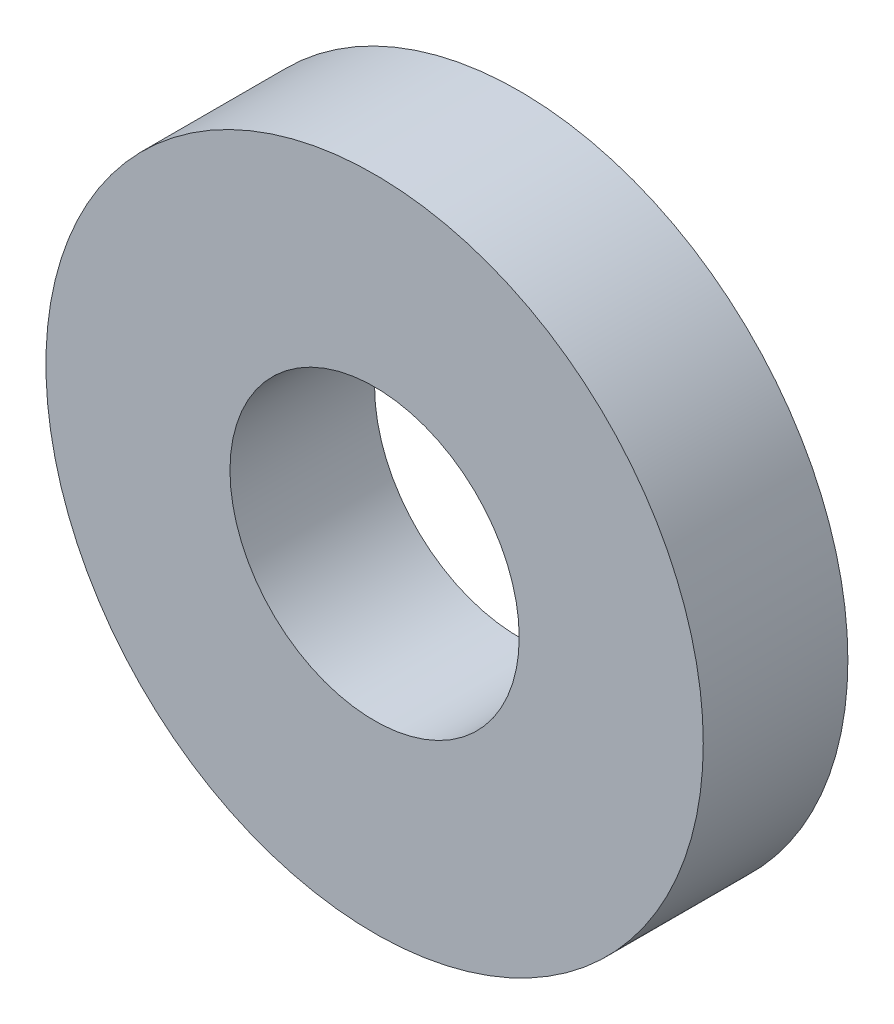
ISO-10303-21;
HEADER;
FILE_DESCRIPTION(('STEP AP214'),'2;1');
FILE_NAME('part.step','',(''),(''),'','','');
FILE_SCHEMA(('AUTOMOTIVE_DESIGN { 1 0 10303 214 1 1 1 1 }'));
ENDSEC;
DATA;
#1=APPLICATION_CONTEXT('core data for automotive mechanical design processes');
#2=APPLICATION_PROTOCOL_DEFINITION('international standard','automotive_design',2000,#1);
#3=PRODUCT_CONTEXT('',#1,'mechanical');
#4=PRODUCT('Part','Part','',(#3));
#5=PRODUCT_RELATED_PRODUCT_CATEGORY('part','',(#4));
#6=PRODUCT_DEFINITION_FORMATION('','',#4);
#7=PRODUCT_DEFINITION_CONTEXT('part definition',#1,'design');
#8=PRODUCT_DEFINITION('design','',#6,#7);
#9=PRODUCT_DEFINITION_SHAPE('','',#8);
#10=(LENGTH_UNIT() NAMED_UNIT(*) SI_UNIT(.MILLI.,.METRE.));
#11=(NAMED_UNIT(*) PLANE_ANGLE_UNIT() SI_UNIT($,.RADIAN.));
#12=(NAMED_UNIT(*) SI_UNIT($,.STERADIAN.) SOLID_ANGLE_UNIT());
#13=UNCERTAINTY_MEASURE_WITH_UNIT(LENGTH_MEASURE(1.E-05),#10,'distance_accuracy_value','');
#14=(GEOMETRIC_REPRESENTATION_CONTEXT(3) GLOBAL_UNCERTAINTY_ASSIGNED_CONTEXT((#13)) GLOBAL_UNIT_ASSIGNED_CONTEXT((#10,
#11,#12)) REPRESENTATION_CONTEXT('',''));
#15=CARTESIAN_POINT('',(0.,0.,0.));
#16=DIRECTION('',(0.,0.,1.));
#17=DIRECTION('',(1.,0.,0.));
#18=AXIS2_PLACEMENT_3D('',#15,#16,#17);
#19=CARTESIAN_POINT('',(0.,0.,1.1));
#20=DIRECTION('',(0.,0.,1.));
#21=DIRECTION('',(1.,0.,0.));
#22=AXIS2_PLACEMENT_3D('',#19,#20,#21);
#23=PLANE('',#22);
#24=CARTESIAN_POINT('',(0.,0.,1.1));
#25=DIRECTION('',(0.,0.,1.));
#26=DIRECTION('',(1.,0.,0.));
#27=AXIS2_PLACEMENT_3D('',#24,#25,#26);
#28=CIRCLE('',#27,2.5);
#29=CARTESIAN_POINT('',(2.5,0.,1.1));
#30=VERTEX_POINT('',#29);
#31=EDGE_CURVE('E10',#30,#30,#28,.T.);
#32=ORIENTED_EDGE('',*,*,#31,.T.);
#33=EDGE_LOOP('',(#32));
#34=FACE_BOUND('',#33,.T.);
#35=CARTESIAN_POINT('',(0.,0.,1.1));
#36=DIRECTION('',(0.,0.,1.));
#37=DIRECTION('',(1.,0.,0.));
#38=AXIS2_PLACEMENT_3D('',#35,#36,#37);
#39=CIRCLE('',#38,1.1);
#40=CARTESIAN_POINT('',(1.1,0.,1.1));
#41=VERTEX_POINT('',#40);
#42=EDGE_CURVE('E41',#41,#41,#39,.T.);
#43=ORIENTED_EDGE('',*,*,#42,.F.);
#44=EDGE_LOOP('',(#43));
#45=FACE_BOUND('',#44,.T.);
#46=ADVANCED_FACE('F30',(#34,#45),#23,.T.);
#47=CARTESIAN_POINT('',(0.,0.,0.));
#48=DIRECTION('',(0.,0.,1.));
#49=DIRECTION('',(1.,0.,0.));
#50=AXIS2_PLACEMENT_3D('',#47,#48,#49);
#51=PLANE('',#50);
#52=CARTESIAN_POINT('',(0.,0.,0.));
#53=DIRECTION('',(0.,0.,1.));
#54=DIRECTION('',(1.,0.,0.));
#55=AXIS2_PLACEMENT_3D('',#52,#53,#54);
#56=CIRCLE('',#55,2.5);
#57=CARTESIAN_POINT('',(2.5,0.,0.));
#58=VERTEX_POINT('',#57);
#59=EDGE_CURVE('E34',#58,#58,#56,.T.);
#60=ORIENTED_EDGE('',*,*,#59,.F.);
#61=EDGE_LOOP('',(#60));
#62=FACE_BOUND('',#61,.T.);
#63=CARTESIAN_POINT('',(0.,0.,0.));
#64=DIRECTION('',(0.,0.,1.));
#65=DIRECTION('',(1.,0.,0.));
#66=AXIS2_PLACEMENT_3D('',#63,#64,#65);
#67=CIRCLE('',#66,1.1);
#68=CARTESIAN_POINT('',(1.1,0.,0.));
#69=VERTEX_POINT('',#68);
#70=EDGE_CURVE('E43',#69,#69,#67,.T.);
#71=ORIENTED_EDGE('',*,*,#70,.T.);
#72=EDGE_LOOP('',(#71));
#73=FACE_BOUND('',#72,.T.);
#74=ADVANCED_FACE('F53',(#62,#73),#51,.F.);
#75=CARTESIAN_POINT('',(0.,0.,1.1));
#76=DIRECTION('',(0.,0.,-1.));
#77=DIRECTION('',(-1.,0.,0.));
#78=AXIS2_PLACEMENT_3D('',#75,#76,#77);
#79=CYLINDRICAL_SURFACE('',#78,2.5);
#80=ORIENTED_EDGE('',*,*,#31,.F.);
#81=EDGE_LOOP('',(#80));
#82=FACE_BOUND('',#81,.T.);
#83=ORIENTED_EDGE('',*,*,#59,.T.);
#84=EDGE_LOOP('',(#83));
#85=FACE_BOUND('',#84,.T.);
#86=ADVANCED_FACE('F32',(#82,#85),#79,.T.);
#87=CARTESIAN_POINT('',(0.,0.,1.1));
#88=DIRECTION('',(0.,0.,-1.));
#89=DIRECTION('',(-1.,0.,0.));
#90=AXIS2_PLACEMENT_3D('',#87,#88,#89);
#91=CYLINDRICAL_SURFACE('',#90,1.1);
#92=ORIENTED_EDGE('',*,*,#42,.T.);
#93=EDGE_LOOP('',(#92));
#94=FACE_BOUND('',#93,.T.);
#95=ORIENTED_EDGE('',*,*,#70,.F.);
#96=EDGE_LOOP('',(#95));
#97=FACE_BOUND('',#96,.T.);
#98=ADVANCED_FACE('F49',(#94,#97),#91,.F.);
#99=CLOSED_SHELL('',(#46,#74,#86,#98));
#100=MANIFOLD_SOLID_BREP('B2',#99);
#101=ADVANCED_BREP_SHAPE_REPRESENTATION('',(#18,#100),#14);
#102=SHAPE_DEFINITION_REPRESENTATION(#9,#101);
ENDSEC;
END-ISO-10303-21;
